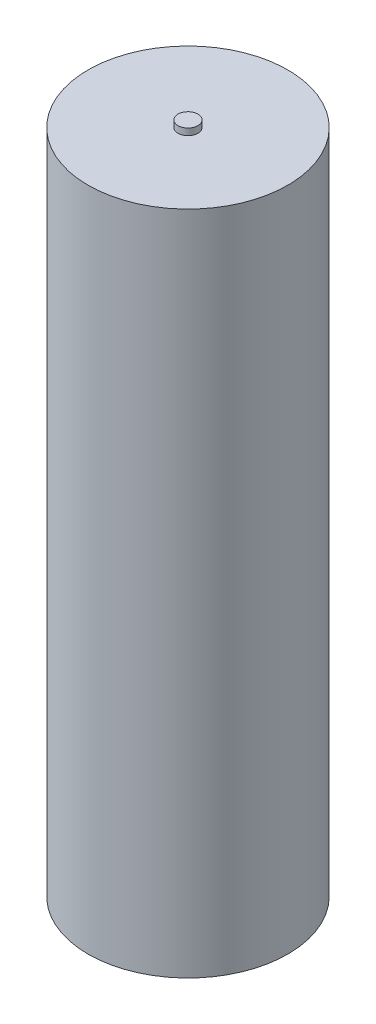
ISO-10303-21;
HEADER;
FILE_DESCRIPTION(('STEP AP214'),'2;1');
FILE_NAME('part.step','',(''),(''),'','','');
FILE_SCHEMA(('AUTOMOTIVE_DESIGN { 1 0 10303 214 1 1 1 1 }'));
ENDSEC;
DATA;
#1=APPLICATION_CONTEXT('core data for automotive mechanical design processes');
#2=APPLICATION_PROTOCOL_DEFINITION('international standard','automotive_design',2000,#1);
#3=PRODUCT_CONTEXT('',#1,'mechanical');
#4=PRODUCT('Part','Part','',(#3));
#5=PRODUCT_RELATED_PRODUCT_CATEGORY('part','',(#4));
#6=PRODUCT_DEFINITION_FORMATION('','',#4);
#7=PRODUCT_DEFINITION_CONTEXT('part definition',#1,'design');
#8=PRODUCT_DEFINITION('design','',#6,#7);
#9=PRODUCT_DEFINITION_SHAPE('','',#8);
#10=(LENGTH_UNIT() NAMED_UNIT(*) SI_UNIT(.MILLI.,.METRE.));
#11=(NAMED_UNIT(*) PLANE_ANGLE_UNIT() SI_UNIT($,.RADIAN.));
#12=(NAMED_UNIT(*) SI_UNIT($,.STERADIAN.) SOLID_ANGLE_UNIT());
#13=UNCERTAINTY_MEASURE_WITH_UNIT(LENGTH_MEASURE(1.E-05),#10,'distance_accuracy_value','');
#14=(GEOMETRIC_REPRESENTATION_CONTEXT(3) GLOBAL_UNCERTAINTY_ASSIGNED_CONTEXT((#13)) GLOBAL_UNIT_ASSIGNED_CONTEXT((#10,
#11,#12)) REPRESENTATION_CONTEXT('',''));
#15=CARTESIAN_POINT('',(0.,0.,0.));
#16=DIRECTION('',(0.,0.,1.));
#17=DIRECTION('',(1.,0.,0.));
#18=AXIS2_PLACEMENT_3D('',#15,#16,#17);
#19=CARTESIAN_POINT('',(0.,10000.,0.));
#20=DIRECTION('',(0.,-1.,0.));
#21=DIRECTION('',(0.,0.,-1.));
#22=AXIS2_PLACEMENT_3D('',#19,#20,#21);
#23=CYLINDRICAL_SURFACE('',#22,1500.);
#24=CARTESIAN_POINT('',(0.,10000.,0.));
#25=DIRECTION('',(0.,1.,0.));
#26=DIRECTION('',(0.,0.,1.));
#27=AXIS2_PLACEMENT_3D('',#24,#25,#26);
#28=CIRCLE('',#27,1500.);
#29=CARTESIAN_POINT('',(0.,10000.,1500.));
#30=VERTEX_POINT('',#29);
#31=EDGE_CURVE('E10',#30,#30,#28,.T.);
#32=ORIENTED_EDGE('',*,*,#31,.F.);
#33=EDGE_LOOP('',(#32));
#34=FACE_BOUND('',#33,.T.);
#35=CARTESIAN_POINT('',(0.,0.,0.));
#36=DIRECTION('',(0.,1.,0.));
#37=DIRECTION('',(0.,0.,1.));
#38=AXIS2_PLACEMENT_3D('',#35,#36,#37);
#39=CIRCLE('',#38,1500.);
#40=CARTESIAN_POINT('',(0.,0.,1500.));
#41=VERTEX_POINT('',#40);
#42=EDGE_CURVE('E40',#41,#41,#39,.T.);
#43=ORIENTED_EDGE('',*,*,#42,.T.);
#44=EDGE_LOOP('',(#43));
#45=FACE_BOUND('',#44,.T.);
#46=ADVANCED_FACE('F37',(#34,#45),#23,.T.);
#47=CARTESIAN_POINT('',(0.,10000.,0.));
#48=DIRECTION('',(0.,1.,0.));
#49=DIRECTION('',(0.,0.,1.));
#50=AXIS2_PLACEMENT_3D('',#47,#48,#49);
#51=PLANE('',#50);
#52=CARTESIAN_POINT('',(0.,10000.,0.));
#53=DIRECTION('',(0.,1.,0.));
#54=DIRECTION('',(0.,0.,1.));
#55=AXIS2_PLACEMENT_3D('',#52,#53,#54);
#56=CIRCLE('',#55,150.);
#57=CARTESIAN_POINT('',(0.,10000.,150.));
#58=VERTEX_POINT('',#57);
#59=EDGE_CURVE('E49',#58,#58,#56,.T.);
#60=ORIENTED_EDGE('',*,*,#59,.F.);
#61=EDGE_LOOP('',(#60));
#62=FACE_BOUND('',#61,.T.);
#63=ORIENTED_EDGE('',*,*,#31,.T.);
#64=EDGE_LOOP('',(#63));
#65=FACE_BOUND('',#64,.T.);
#66=ADVANCED_FACE('F64',(#62,#65),#51,.T.);
#67=CARTESIAN_POINT('',(0.,0.,0.));
#68=DIRECTION('',(0.,1.,0.));
#69=DIRECTION('',(0.,0.,1.));
#70=AXIS2_PLACEMENT_3D('',#67,#68,#69);
#71=PLANE('',#70);
#72=ORIENTED_EDGE('',*,*,#42,.F.);
#73=EDGE_LOOP('',(#72));
#74=FACE_BOUND('',#73,.T.);
#75=ADVANCED_FACE('F60',(#74),#71,.F.);
#76=CARTESIAN_POINT('',(0.,10100.,0.));
#77=DIRECTION('',(0.,-1.,0.));
#78=DIRECTION('',(0.,0.,-1.));
#79=AXIS2_PLACEMENT_3D('',#76,#77,#78);
#80=CYLINDRICAL_SURFACE('',#79,150.);
#81=CARTESIAN_POINT('',(0.,10100.,0.));
#82=DIRECTION('',(0.,1.,0.));
#83=DIRECTION('',(0.,0.,1.));
#84=AXIS2_PLACEMENT_3D('',#81,#82,#83);
#85=CIRCLE('',#84,150.);
#86=CARTESIAN_POINT('',(0.,10100.,150.));
#87=VERTEX_POINT('',#86);
#88=EDGE_CURVE('E47',#87,#87,#85,.T.);
#89=ORIENTED_EDGE('',*,*,#88,.F.);
#90=EDGE_LOOP('',(#89));
#91=FACE_BOUND('',#90,.T.);
#92=ORIENTED_EDGE('',*,*,#59,.T.);
#93=EDGE_LOOP('',(#92));
#94=FACE_BOUND('',#93,.T.);
#95=ADVANCED_FACE('F57',(#91,#94),#80,.T.);
#96=CARTESIAN_POINT('',(0.,10100.,0.));
#97=DIRECTION('',(0.,1.,0.));
#98=DIRECTION('',(0.,0.,1.));
#99=AXIS2_PLACEMENT_3D('',#96,#97,#98);
#100=PLANE('',#99);
#101=ORIENTED_EDGE('',*,*,#88,.T.);
#102=EDGE_LOOP('',(#101));
#103=FACE_BOUND('',#102,.T.);
#104=ADVANCED_FACE('F55',(#103),#100,.T.);
#105=CLOSED_SHELL('',(#46,#66,#75,#95,#104));
#106=MANIFOLD_SOLID_BREP('B2',#105);
#107=ADVANCED_BREP_SHAPE_REPRESENTATION('',(#18,#106),#14);
#108=SHAPE_DEFINITION_REPRESENTATION(#9,#107);
ENDSEC;
END-ISO-10303-21;
